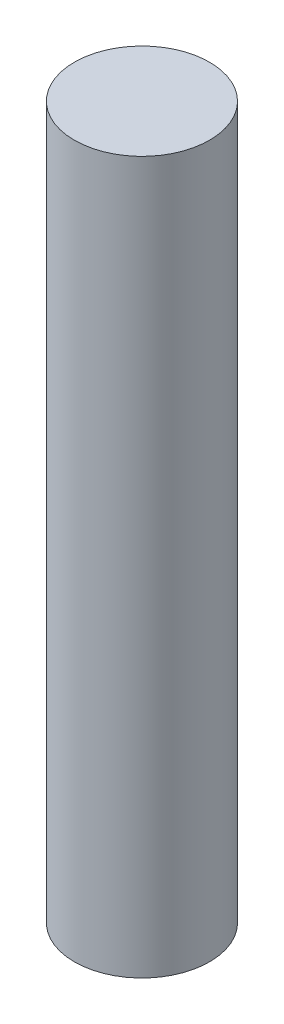
ISO-10303-21;
HEADER;
FILE_DESCRIPTION(('STEP AP214'),'2;1');
FILE_NAME('part.step','',(''),(''),'','','');
FILE_SCHEMA(('AUTOMOTIVE_DESIGN { 1 0 10303 214 1 1 1 1 }'));
ENDSEC;
DATA;
#1=APPLICATION_CONTEXT('core data for automotive mechanical design processes');
#2=APPLICATION_PROTOCOL_DEFINITION('international standard','automotive_design',2000,#1);
#3=PRODUCT_CONTEXT('',#1,'mechanical');
#4=PRODUCT('Part','Part','',(#3));
#5=PRODUCT_RELATED_PRODUCT_CATEGORY('part','',(#4));
#6=PRODUCT_DEFINITION_FORMATION('','',#4);
#7=PRODUCT_DEFINITION_CONTEXT('part definition',#1,'design');
#8=PRODUCT_DEFINITION('design','',#6,#7);
#9=PRODUCT_DEFINITION_SHAPE('','',#8);
#10=(LENGTH_UNIT() NAMED_UNIT(*) SI_UNIT(.MILLI.,.METRE.));
#11=(NAMED_UNIT(*) PLANE_ANGLE_UNIT() SI_UNIT($,.RADIAN.));
#12=(NAMED_UNIT(*) SI_UNIT($,.STERADIAN.) SOLID_ANGLE_UNIT());
#13=UNCERTAINTY_MEASURE_WITH_UNIT(LENGTH_MEASURE(1.E-05),#10,'distance_accuracy_value','');
#14=(GEOMETRIC_REPRESENTATION_CONTEXT(3) GLOBAL_UNCERTAINTY_ASSIGNED_CONTEXT((#13)) GLOBAL_UNIT_ASSIGNED_CONTEXT((#10,
#11,#12)) REPRESENTATION_CONTEXT('',''));
#15=CARTESIAN_POINT('',(0.,0.,0.));
#16=DIRECTION('',(0.,0.,1.));
#17=DIRECTION('',(1.,0.,0.));
#18=AXIS2_PLACEMENT_3D('',#15,#16,#17);
#19=CARTESIAN_POINT('',(0.,30.,0.));
#20=DIRECTION('',(0.,-1.,0.));
#21=DIRECTION('',(0.,0.,-1.));
#22=AXIS2_PLACEMENT_3D('',#19,#20,#21);
#23=CYLINDRICAL_SURFACE('',#22,2.85);
#24=CARTESIAN_POINT('',(0.,30.,0.));
#25=DIRECTION('',(0.,1.,0.));
#26=DIRECTION('',(0.,0.,1.));
#27=AXIS2_PLACEMENT_3D('',#24,#25,#26);
#28=CIRCLE('',#27,2.85);
#29=CARTESIAN_POINT('',(0.,30.,2.85));
#30=VERTEX_POINT('',#29);
#31=EDGE_CURVE('E10',#30,#30,#28,.T.);
#32=ORIENTED_EDGE('',*,*,#31,.F.);
#33=EDGE_LOOP('',(#32));
#34=FACE_BOUND('',#33,.T.);
#35=CARTESIAN_POINT('',(0.,0.,0.));
#36=DIRECTION('',(0.,1.,0.));
#37=DIRECTION('',(0.,0.,1.));
#38=AXIS2_PLACEMENT_3D('',#35,#36,#37);
#39=CIRCLE('',#38,2.85);
#40=CARTESIAN_POINT('',(0.,0.,2.85));
#41=VERTEX_POINT('',#40);
#42=EDGE_CURVE('E40',#41,#41,#39,.T.);
#43=ORIENTED_EDGE('',*,*,#42,.T.);
#44=EDGE_LOOP('',(#43));
#45=FACE_BOUND('',#44,.T.);
#46=ADVANCED_FACE('F37',(#34,#45),#23,.T.);
#47=CARTESIAN_POINT('',(0.,30.,0.));
#48=DIRECTION('',(0.,1.,0.));
#49=DIRECTION('',(0.,0.,1.));
#50=AXIS2_PLACEMENT_3D('',#47,#48,#49);
#51=PLANE('',#50);
#52=ORIENTED_EDGE('',*,*,#31,.T.);
#53=EDGE_LOOP('',(#52));
#54=FACE_BOUND('',#53,.T.);
#55=ADVANCED_FACE('F54',(#54),#51,.T.);
#56=CARTESIAN_POINT('',(0.,0.,0.));
#57=DIRECTION('',(0.,1.,0.));
#58=DIRECTION('',(0.,0.,1.));
#59=AXIS2_PLACEMENT_3D('',#56,#57,#58);
#60=PLANE('',#59);
#61=ORIENTED_EDGE('',*,*,#42,.F.);
#62=EDGE_LOOP('',(#61));
#63=FACE_BOUND('',#62,.T.);
#64=ADVANCED_FACE('F52',(#63),#60,.F.);
#65=CLOSED_SHELL('',(#46,#55,#64));
#66=MANIFOLD_SOLID_BREP('B2',#65);
#67=ADVANCED_BREP_SHAPE_REPRESENTATION('',(#18,#66),#14);
#68=SHAPE_DEFINITION_REPRESENTATION(#9,#67);
ENDSEC;
END-ISO-10303-21;
